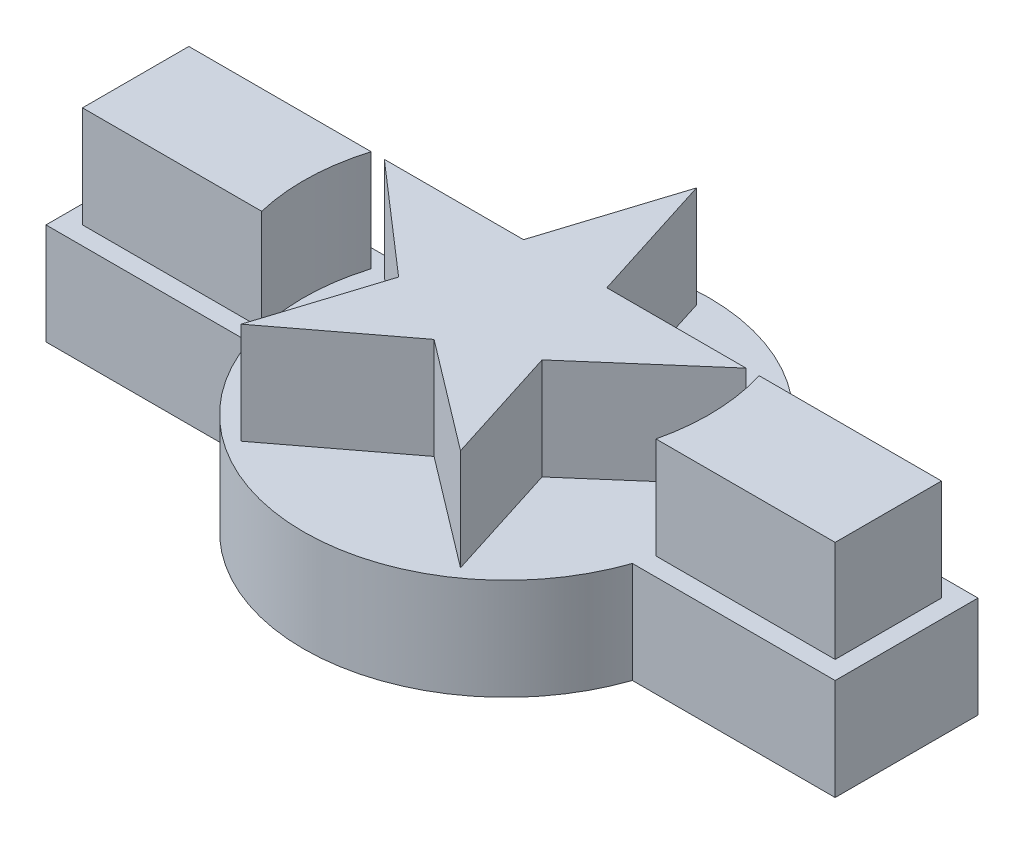
ISO-10303-21;
HEADER;
FILE_DESCRIPTION(('STEP AP214'),'2;1');
FILE_NAME('part.step','',(''),(''),'','','');
FILE_SCHEMA(('AUTOMOTIVE_DESIGN { 1 0 10303 214 1 1 1 1 }'));
ENDSEC;
DATA;
#1=APPLICATION_CONTEXT('core data for automotive mechanical design processes');
#2=APPLICATION_PROTOCOL_DEFINITION('international standard','automotive_design',2000,#1);
#3=PRODUCT_CONTEXT('',#1,'mechanical');
#4=PRODUCT('Part','Part','',(#3));
#5=PRODUCT_RELATED_PRODUCT_CATEGORY('part','',(#4));
#6=PRODUCT_DEFINITION_FORMATION('','',#4);
#7=PRODUCT_DEFINITION_CONTEXT('part definition',#1,'design');
#8=PRODUCT_DEFINITION('design','',#6,#7);
#9=PRODUCT_DEFINITION_SHAPE('','',#8);
#10=(LENGTH_UNIT() NAMED_UNIT(*) SI_UNIT(.MILLI.,.METRE.));
#11=(NAMED_UNIT(*) PLANE_ANGLE_UNIT() SI_UNIT($,.RADIAN.));
#12=(NAMED_UNIT(*) SI_UNIT($,.STERADIAN.) SOLID_ANGLE_UNIT());
#13=UNCERTAINTY_MEASURE_WITH_UNIT(LENGTH_MEASURE(1.E-05),#10,'distance_accuracy_value','');
#14=(GEOMETRIC_REPRESENTATION_CONTEXT(3) GLOBAL_UNCERTAINTY_ASSIGNED_CONTEXT((#13)) GLOBAL_UNIT_ASSIGNED_CONTEXT((#10,
#11,#12)) REPRESENTATION_CONTEXT('',''));
#15=CARTESIAN_POINT('',(0.,0.,0.));
#16=DIRECTION('',(0.,0.,1.));
#17=DIRECTION('',(1.,0.,0.));
#18=AXIS2_PLACEMENT_3D('',#15,#16,#17);
#19=CARTESIAN_POINT('',(-0.85739094536806,5.,1.12957085553152));
#20=DIRECTION('',(-0.604599114862384,0.,0.796529918024189));
#21=DIRECTION('',(0.796529918024189,0.,0.604599114862384));
#22=AXIS2_PLACEMENT_3D('',#19,#20,#21);
#23=PLANE('',#22);
#24=DIRECTION('',(-0.796529918024189,0.,-0.604599114862384));
#25=VECTOR('',#24,1.);
#26=CARTESIAN_POINT('',(-0.85739094536806,2.5,1.12957085553152));
#27=LINE('',#26,#25);
#28=CARTESIAN_POINT('',(2.70346756283628,2.5,3.83240957319178));
#29=VERTEX_POINT('',#28);
#30=CARTESIAN_POINT('',(0.,2.5,1.7803660045027));
#31=VERTEX_POINT('',#30);
#32=EDGE_CURVE('E365',#29,#31,#27,.T.);
#33=ORIENTED_EDGE('',*,*,#32,.F.);
#34=DIRECTION('',(0.,-1.,0.));
#35=VECTOR('',#34,1.);
#36=CARTESIAN_POINT('',(2.70346756283628,5.,3.83240957319178));
#37=LINE('',#36,#35);
#38=CARTESIAN_POINT('',(2.70346756283628,5.,3.83240957319178));
#39=VERTEX_POINT('',#38);
#40=EDGE_CURVE('E11',#39,#29,#37,.T.);
#41=ORIENTED_EDGE('',*,*,#40,.F.);
#42=DIRECTION('',(-0.796529918024189,0.,-0.604599114862384));
#43=VECTOR('',#42,1.);
#44=CARTESIAN_POINT('',(-0.85739094536806,5.,1.12957085553152));
#45=LINE('',#44,#43);
#46=CARTESIAN_POINT('',(0.,5.,1.7803660045027));
#47=VERTEX_POINT('',#46);
#48=EDGE_CURVE('E47',#39,#47,#45,.T.);
#49=ORIENTED_EDGE('',*,*,#48,.T.);
#50=DIRECTION('',(0.,-1.,0.));
#51=VECTOR('',#50,1.);
#52=CARTESIAN_POINT('',(0.,5.,1.7803660045027));
#53=LINE('',#52,#51);
#54=EDGE_CURVE('E297',#47,#31,#53,.T.);
#55=ORIENTED_EDGE('',*,*,#54,.T.);
#56=EDGE_LOOP('',(#33,#41,#49,#55));
#57=FACE_BOUND('',#56,.T.);
#58=ADVANCED_FACE('F33',(#57),#23,.T.);
#59=CARTESIAN_POINT('',(1.35173378141814,5.,-0.428795213404107));
#60=DIRECTION('',(0.953190667792949,0.,-0.302369890750439));
#61=DIRECTION('',(-0.302369890750439,0.,-0.953190667792949));
#62=AXIS2_PLACEMENT_3D('',#59,#60,#61);
#63=PLANE('',#62);
#64=DIRECTION('',(0.302369890750439,0.,0.953190667792949));
#65=VECTOR('',#64,1.);
#66=CARTESIAN_POINT('',(1.35173378141814,2.5,-0.428795213404107));
#67=LINE('',#66,#65);
#68=CARTESIAN_POINT('',(1.76883104180645,2.5,0.886061947728644));
#69=VERTEX_POINT('',#68);
#70=EDGE_CURVE('E363',#69,#29,#67,.T.);
#71=ORIENTED_EDGE('',*,*,#70,.F.);
#72=DIRECTION('',(0.,-1.,0.));
#73=VECTOR('',#72,1.);
#74=CARTESIAN_POINT('',(1.76883104180645,5.,0.886061947728644));
#75=LINE('',#74,#73);
#76=CARTESIAN_POINT('',(1.76883104180645,5.,0.886061947728644));
#77=VERTEX_POINT('',#76);
#78=EDGE_CURVE('E40',#77,#69,#75,.T.);
#79=ORIENTED_EDGE('',*,*,#78,.F.);
#80=DIRECTION('',(0.302369890750439,0.,0.953190667792949));
#81=VECTOR('',#80,1.);
#82=CARTESIAN_POINT('',(1.35173378141814,5.,-0.428795213404107));
#83=LINE('',#82,#81);
#84=EDGE_CURVE('E387',#77,#39,#83,.T.);
#85=ORIENTED_EDGE('',*,*,#84,.T.);
#86=ORIENTED_EDGE('',*,*,#40,.T.);
#87=EDGE_LOOP('',(#71,#79,#85,#86));
#88=FACE_BOUND('',#87,.T.);
#89=ADVANCED_FACE('F411',(#88),#63,.T.);
#90=CARTESIAN_POINT('',(1.20004809720322,5.,1.38049741816829));
#91=DIRECTION('',(0.656059028990503,0.,0.754709580222776));
#92=DIRECTION('',(0.754709580222776,0.,-0.656059028990503));
#93=AXIS2_PLACEMENT_3D('',#90,#91,#92);
#94=PLANE('',#93);
#95=DIRECTION('',(-0.754709580222776,0.,0.656059028990503));
#96=VECTOR('',#95,1.);
#97=CARTESIAN_POINT('',(1.20004809720322,2.5,1.38049741816829));
#98=LINE('',#97,#96);
#99=CARTESIAN_POINT('',(4.45932863153049,2.5,-1.45275192514496));
#100=VERTEX_POINT('',#99);
#101=EDGE_CURVE('E361',#100,#69,#98,.T.);
#102=ORIENTED_EDGE('',*,*,#101,.F.);
#103=DIRECTION('',(0.,-1.,0.));
#104=VECTOR('',#103,1.);
#105=CARTESIAN_POINT('',(4.45932863153049,5.,-1.45275192514496));
#106=LINE('',#105,#104);
#107=CARTESIAN_POINT('',(4.45932863153049,5.,-1.45275192514496));
#108=VERTEX_POINT('',#107);
#109=EDGE_CURVE('E401',#108,#100,#106,.T.);
#110=ORIENTED_EDGE('',*,*,#109,.F.);
#111=DIRECTION('',(-0.754709580222776,0.,0.656059028990503));
#112=VECTOR('',#111,1.);
#113=CARTESIAN_POINT('',(1.20004809720322,5.,1.38049741816829));
#114=LINE('',#113,#112);
#115=EDGE_CURVE('E390',#108,#77,#114,.T.);
#116=ORIENTED_EDGE('',*,*,#115,.T.);
#117=ORIENTED_EDGE('',*,*,#78,.T.);
#118=EDGE_LOOP('',(#102,#110,#116,#117));
#119=FACE_BOUND('',#118,.T.);
#120=ADVANCED_FACE('F406',(#119),#94,.T.);
#121=CARTESIAN_POINT('',(0.,5.,-1.45275192514496));
#122=DIRECTION('',(0.,0.,-1.));
#123=DIRECTION('',(-1.,0.,0.));
#124=AXIS2_PLACEMENT_3D('',#121,#122,#123);
#125=PLANE('',#124);
#126=DIRECTION('',(1.,0.,0.));
#127=VECTOR('',#126,1.);
#128=CARTESIAN_POINT('',(0.,2.5,-1.45275192514496));
#129=LINE('',#128,#127);
#130=CARTESIAN_POINT('',(1.0269155792224,2.5,-1.45275192514496));
#131=VERTEX_POINT('',#130);
#132=EDGE_CURVE('E359',#131,#100,#129,.T.);
#133=ORIENTED_EDGE('',*,*,#132,.F.);
#134=DIRECTION('',(0.,-1.,0.));
#135=VECTOR('',#134,1.);
#136=CARTESIAN_POINT('',(1.0269155792224,5.,-1.45275192514496));
#137=LINE('',#136,#135);
#138=CARTESIAN_POINT('',(1.0269155792224,5.,-1.45275192514496));
#139=VERTEX_POINT('',#138);
#140=EDGE_CURVE('E398',#139,#131,#137,.T.);
#141=ORIENTED_EDGE('',*,*,#140,.F.);
#142=DIRECTION('',(1.,0.,0.));
#143=VECTOR('',#142,1.);
#144=CARTESIAN_POINT('',(0.,5.,-1.45275192514496));
#145=LINE('',#144,#143);
#146=EDGE_CURVE('E393',#139,#108,#145,.T.);
#147=ORIENTED_EDGE('',*,*,#146,.T.);
#148=ORIENTED_EDGE('',*,*,#109,.T.);
#149=EDGE_LOOP('',(#133,#141,#147,#148));
#150=FACE_BOUND('',#149,.T.);
#151=ADVANCED_FACE('F430',(#150),#125,.T.);
#152=CARTESIAN_POINT('',(1.35173378141814,5.,-0.428795213404107));
#153=DIRECTION('',(0.953190667792949,0.,-0.302369890750439));
#154=DIRECTION('',(-0.302369890750439,0.,-0.953190667792949));
#155=AXIS2_PLACEMENT_3D('',#152,#153,#154);
#156=PLANE('',#155);
#157=DIRECTION('',(0.302369890750439,0.,0.953190667792949));
#158=VECTOR('',#157,1.);
#159=CARTESIAN_POINT('',(1.35173378141814,2.5,-0.428795213404107));
#160=LINE('',#159,#158);
#161=CARTESIAN_POINT('',(0.,2.5,-4.69));
#162=VERTEX_POINT('',#161);
#163=EDGE_CURVE('E357',#162,#131,#160,.T.);
#164=ORIENTED_EDGE('',*,*,#163,.F.);
#165=DIRECTION('',(0.,-1.,0.));
#166=VECTOR('',#165,1.);
#167=CARTESIAN_POINT('',(0.,5.,-4.69));
#168=LINE('',#167,#166);
#169=CARTESIAN_POINT('',(0.,5.,-4.69));
#170=VERTEX_POINT('',#169);
#171=EDGE_CURVE('E55',#170,#162,#168,.T.);
#172=ORIENTED_EDGE('',*,*,#171,.F.);
#173=DIRECTION('',(0.302369890750439,0.,0.953190667792949));
#174=VECTOR('',#173,1.);
#175=CARTESIAN_POINT('',(1.35173378141814,5.,-0.428795213404107));
#176=LINE('',#175,#174);
#177=EDGE_CURVE('E396',#170,#139,#176,.T.);
#178=ORIENTED_EDGE('',*,*,#177,.T.);
#179=ORIENTED_EDGE('',*,*,#140,.T.);
#180=EDGE_LOOP('',(#164,#172,#178,#179));
#181=FACE_BOUND('',#180,.T.);
#182=ADVANCED_FACE('F431',(#181),#156,.T.);
#183=CARTESIAN_POINT('',(0.,5.,0.));
#184=DIRECTION('',(0.,1.,0.));
#185=DIRECTION('',(0.,0.,1.));
#186=AXIS2_PLACEMENT_3D('',#183,#184,#185);
#187=PLANE('',#186);
#188=ORIENTED_EDGE('',*,*,#48,.F.);
#189=ORIENTED_EDGE('',*,*,#84,.F.);
#190=ORIENTED_EDGE('',*,*,#115,.F.);
#191=ORIENTED_EDGE('',*,*,#146,.F.);
#192=ORIENTED_EDGE('',*,*,#177,.F.);
#193=DIRECTION('',(-0.302369890750439,0.,0.953190667792949));
#194=VECTOR('',#193,1.);
#195=CARTESIAN_POINT('',(-1.35173378141814,5.,-0.428795213404107));
#196=LINE('',#195,#194);
#197=CARTESIAN_POINT('',(-1.0269155792224,5.,-1.45275192514496));
#198=VERTEX_POINT('',#197);
#199=EDGE_CURVE('E295',#170,#198,#196,.T.);
#200=ORIENTED_EDGE('',*,*,#199,.T.);
#201=DIRECTION('',(-1.,0.,0.));
#202=VECTOR('',#201,1.);
#203=CARTESIAN_POINT('',(0.,5.,-1.45275192514496));
#204=LINE('',#203,#202);
#205=CARTESIAN_POINT('',(-4.45932863153049,5.,-1.45275192514496));
#206=VERTEX_POINT('',#205);
#207=EDGE_CURVE('E293',#198,#206,#204,.T.);
#208=ORIENTED_EDGE('',*,*,#207,.T.);
#209=DIRECTION('',(0.754709580222776,0.,0.656059028990503));
#210=VECTOR('',#209,1.);
#211=CARTESIAN_POINT('',(-1.20004809720322,5.,1.38049741816829));
#212=LINE('',#211,#210);
#213=CARTESIAN_POINT('',(-1.76883104180645,5.,0.886061947728644));
#214=VERTEX_POINT('',#213);
#215=EDGE_CURVE('E291',#206,#214,#212,.T.);
#216=ORIENTED_EDGE('',*,*,#215,.T.);
#217=DIRECTION('',(-0.302369890750439,0.,0.953190667792949));
#218=VECTOR('',#217,1.);
#219=CARTESIAN_POINT('',(-1.35173378141814,5.,-0.428795213404107));
#220=LINE('',#219,#218);
#221=CARTESIAN_POINT('',(-2.70346756283628,5.,3.83240957319178));
#222=VERTEX_POINT('',#221);
#223=EDGE_CURVE('E289',#214,#222,#220,.T.);
#224=ORIENTED_EDGE('',*,*,#223,.T.);
#225=DIRECTION('',(0.796529918024189,0.,-0.604599114862384));
#226=VECTOR('',#225,1.);
#227=CARTESIAN_POINT('',(0.85739094536806,5.,1.12957085553152));
#228=LINE('',#227,#226);
#229=EDGE_CURVE('E287',#222,#47,#228,.T.);
#230=ORIENTED_EDGE('',*,*,#229,.T.);
#231=EDGE_LOOP('',(#188,#189,#190,#191,#192,#200,#208,#216,#224,#230));
#232=FACE_BOUND('',#231,.T.);
#233=ADVANCED_FACE('F413',(#232),#187,.T.);
#234=CARTESIAN_POINT('',(0.,0.,0.));
#235=DIRECTION('',(0.,1.,0.));
#236=DIRECTION('',(0.,0.,1.));
#237=AXIS2_PLACEMENT_3D('',#234,#235,#236);
#238=PLANE('',#237);
#239=CARTESIAN_POINT('',(0.,0.,0.));
#240=DIRECTION('',(0.,1.,0.));
#241=DIRECTION('',(0.,0.,1.));
#242=AXIS2_PLACEMENT_3D('',#239,#240,#241);
#243=CIRCLE('',#242,5.);
#244=CARTESIAN_POINT('',(-4.73033846702723,0.,1.61984505041762));
#245=VERTEX_POINT('',#244);
#246=CARTESIAN_POINT('',(4.73033846702723,0.,1.61984505041762));
#247=VERTEX_POINT('',#246);
#248=EDGE_CURVE('E335',#245,#247,#243,.T.);
#249=ORIENTED_EDGE('',*,*,#248,.F.);
#250=DIRECTION('',(1.,0.,0.));
#251=VECTOR('',#250,1.);
#252=CARTESIAN_POINT('',(0.,0.,1.61984505041763));
#253=LINE('',#252,#251);
#254=CARTESIAN_POINT('',(-9.73033846702723,0.,1.61984505041763));
#255=VERTEX_POINT('',#254);
#256=EDGE_CURVE('E218',#255,#245,#253,.T.);
#257=ORIENTED_EDGE('',*,*,#256,.F.);
#258=DIRECTION('',(0.,0.,1.));
#259=VECTOR('',#258,1.);
#260=CARTESIAN_POINT('',(-9.73033846702723,0.,0.));
#261=LINE('',#260,#259);
#262=CARTESIAN_POINT('',(-9.73033846702723,0.,-1.90275192514496));
#263=VERTEX_POINT('',#262);
#264=EDGE_CURVE('E273',#263,#255,#261,.T.);
#265=ORIENTED_EDGE('',*,*,#264,.F.);
#266=DIRECTION('',(1.,0.,0.));
#267=VECTOR('',#266,1.);
#268=CARTESIAN_POINT('',(0.,0.,-1.90275192514496));
#269=LINE('',#268,#267);
#270=CARTESIAN_POINT('',(-4.62380093768721,0.,-1.90275192514496));
#271=VERTEX_POINT('',#270);
#272=EDGE_CURVE('E243',#263,#271,#269,.T.);
#273=ORIENTED_EDGE('',*,*,#272,.T.);
#274=CARTESIAN_POINT('',(4.62380093768721,0.,-1.90275192514496));
#275=VERTEX_POINT('',#274);
#276=EDGE_CURVE('E339',#275,#271,#243,.T.);
#277=ORIENTED_EDGE('',*,*,#276,.F.);
#278=DIRECTION('',(-1.,0.,0.));
#279=VECTOR('',#278,1.);
#280=CARTESIAN_POINT('',(0.,0.,-1.90275192514496));
#281=LINE('',#280,#279);
#282=CARTESIAN_POINT('',(9.73033846702723,0.,-1.90275192514496));
#283=VERTEX_POINT('',#282);
#284=EDGE_CURVE('E369',#283,#275,#281,.T.);
#285=ORIENTED_EDGE('',*,*,#284,.F.);
#286=DIRECTION('',(0.,0.,1.));
#287=VECTOR('',#286,1.);
#288=CARTESIAN_POINT('',(9.73033846702723,0.,0.));
#289=LINE('',#288,#287);
#290=CARTESIAN_POINT('',(9.73033846702723,0.,1.61984505041763));
#291=VERTEX_POINT('',#290);
#292=EDGE_CURVE('E373',#283,#291,#289,.T.);
#293=ORIENTED_EDGE('',*,*,#292,.T.);
#294=DIRECTION('',(-1.,0.,0.));
#295=VECTOR('',#294,1.);
#296=CARTESIAN_POINT('',(0.,0.,1.61984505041763));
#297=LINE('',#296,#295);
#298=EDGE_CURVE('E370',#291,#247,#297,.T.);
#299=ORIENTED_EDGE('',*,*,#298,.T.);
#300=EDGE_LOOP('',(#249,#257,#265,#273,#277,#285,#293,#299));
#301=FACE_BOUND('',#300,.T.);
#302=ADVANCED_FACE('F470',(#301),#238,.F.);
#303=CARTESIAN_POINT('',(0.,2.5,0.));
#304=DIRECTION('',(0.,-1.,0.));
#305=DIRECTION('',(0.,0.,-1.));
#306=AXIS2_PLACEMENT_3D('',#303,#304,#305);
#307=CYLINDRICAL_SURFACE('',#306,5.);
#308=ORIENTED_EDGE('',*,*,#248,.T.);
#309=DIRECTION('',(0.,-1.,0.));
#310=VECTOR('',#309,1.);
#311=CARTESIAN_POINT('',(4.73033846702723,2.5,1.61984505041762));
#312=LINE('',#311,#310);
#313=CARTESIAN_POINT('',(4.73033846702723,2.5,1.61984505041762));
#314=VERTEX_POINT('',#313);
#315=EDGE_CURVE('E384',#314,#247,#312,.T.);
#316=ORIENTED_EDGE('',*,*,#315,.F.);
#317=CARTESIAN_POINT('',(0.,2.5,0.));
#318=DIRECTION('',(0.,1.,0.));
#319=DIRECTION('',(0.,0.,1.));
#320=AXIS2_PLACEMENT_3D('',#317,#318,#319);
#321=CIRCLE('',#320,5.);
#322=CARTESIAN_POINT('',(-4.73033846702723,2.5,1.61984505041762));
#323=VERTEX_POINT('',#322);
#324=EDGE_CURVE('E343',#323,#314,#321,.T.);
#325=ORIENTED_EDGE('',*,*,#324,.F.);
#326=DIRECTION('',(0.,-1.,0.));
#327=VECTOR('',#326,1.);
#328=CARTESIAN_POINT('',(-4.73033846702723,2.5,1.61984505041762));
#329=LINE('',#328,#327);
#330=EDGE_CURVE('E284',#323,#245,#329,.T.);
#331=ORIENTED_EDGE('',*,*,#330,.T.);
#332=EDGE_LOOP('',(#308,#316,#325,#331));
#333=FACE_BOUND('',#332,.T.);
#334=ADVANCED_FACE('F473',(#333),#307,.T.);
#335=CARTESIAN_POINT('',(0.,2.5,1.61984505041763));
#336=DIRECTION('',(0.,0.,1.));
#337=DIRECTION('',(1.,0.,0.));
#338=AXIS2_PLACEMENT_3D('',#335,#336,#337);
#339=PLANE('',#338);
#340=ORIENTED_EDGE('',*,*,#298,.F.);
#341=DIRECTION('',(0.,-1.,0.));
#342=VECTOR('',#341,1.);
#343=CARTESIAN_POINT('',(9.73033846702723,2.5,1.61984505041763));
#344=LINE('',#343,#342);
#345=CARTESIAN_POINT('',(9.73033846702723,2.5,1.61984505041763));
#346=VERTEX_POINT('',#345);
#347=EDGE_CURVE('E382',#346,#291,#344,.T.);
#348=ORIENTED_EDGE('',*,*,#347,.F.);
#349=DIRECTION('',(-1.,0.,0.));
#350=VECTOR('',#349,1.);
#351=CARTESIAN_POINT('',(0.,2.5,1.61984505041763));
#352=LINE('',#351,#350);
#353=EDGE_CURVE('E348',#346,#314,#352,.T.);
#354=ORIENTED_EDGE('',*,*,#353,.T.);
#355=ORIENTED_EDGE('',*,*,#315,.T.);
#356=EDGE_LOOP('',(#340,#348,#354,#355));
#357=FACE_BOUND('',#356,.T.);
#358=ADVANCED_FACE('F477',(#357),#339,.T.);
#359=CARTESIAN_POINT('',(9.73033846702723,2.5,0.));
#360=DIRECTION('',(1.,0.,0.));
#361=DIRECTION('',(0.,0.,-1.));
#362=AXIS2_PLACEMENT_3D('',#359,#360,#361);
#363=PLANE('',#362);
#364=ORIENTED_EDGE('',*,*,#292,.F.);
#365=DIRECTION('',(0.,-1.,0.));
#366=VECTOR('',#365,1.);
#367=CARTESIAN_POINT('',(9.73033846702723,2.5,-1.90275192514496));
#368=LINE('',#367,#366);
#369=CARTESIAN_POINT('',(9.73033846702723,2.5,-1.90275192514496));
#370=VERTEX_POINT('',#369);
#371=EDGE_CURVE('E380',#370,#283,#368,.T.);
#372=ORIENTED_EDGE('',*,*,#371,.F.);
#373=DIRECTION('',(0.,0.,1.));
#374=VECTOR('',#373,1.);
#375=CARTESIAN_POINT('',(9.73033846702723,2.5,0.));
#376=LINE('',#375,#374);
#377=EDGE_CURVE('E351',#370,#346,#376,.T.);
#378=ORIENTED_EDGE('',*,*,#377,.T.);
#379=ORIENTED_EDGE('',*,*,#347,.T.);
#380=EDGE_LOOP('',(#364,#372,#378,#379));
#381=FACE_BOUND('',#380,.T.);
#382=ADVANCED_FACE('F480',(#381),#363,.T.);
#383=CARTESIAN_POINT('',(0.,2.5,-1.90275192514496));
#384=DIRECTION('',(0.,0.,1.));
#385=DIRECTION('',(1.,0.,0.));
#386=AXIS2_PLACEMENT_3D('',#383,#384,#385);
#387=PLANE('',#386);
#388=ORIENTED_EDGE('',*,*,#284,.T.);
#389=DIRECTION('',(0.,-1.,0.));
#390=VECTOR('',#389,1.);
#391=CARTESIAN_POINT('',(4.62380093768721,2.5,-1.90275192514496));
#392=LINE('',#391,#390);
#393=CARTESIAN_POINT('',(4.62380093768721,2.5,-1.90275192514496));
#394=VERTEX_POINT('',#393);
#395=EDGE_CURVE('E367',#394,#275,#392,.T.);
#396=ORIENTED_EDGE('',*,*,#395,.F.);
#397=DIRECTION('',(-1.,0.,0.));
#398=VECTOR('',#397,1.);
#399=CARTESIAN_POINT('',(0.,2.5,-1.90275192514496));
#400=LINE('',#399,#398);
#401=EDGE_CURVE('E354',#370,#394,#400,.T.);
#402=ORIENTED_EDGE('',*,*,#401,.F.);
#403=ORIENTED_EDGE('',*,*,#371,.T.);
#404=EDGE_LOOP('',(#388,#396,#402,#403));
#405=FACE_BOUND('',#404,.T.);
#406=ADVANCED_FACE('F484',(#405),#387,.F.);
#407=ORIENTED_EDGE('',*,*,#276,.T.);
#408=DIRECTION('',(0.,-1.,0.));
#409=VECTOR('',#408,1.);
#410=CARTESIAN_POINT('',(-4.62380093768721,2.5,-1.90275192514496));
#411=LINE('',#410,#409);
#412=CARTESIAN_POINT('',(-4.62380093768721,2.5,-1.90275192514496));
#413=VERTEX_POINT('',#412);
#414=EDGE_CURVE('E270',#413,#271,#411,.T.);
#415=ORIENTED_EDGE('',*,*,#414,.F.);
#416=EDGE_CURVE('E342',#394,#413,#321,.T.);
#417=ORIENTED_EDGE('',*,*,#416,.F.);
#418=ORIENTED_EDGE('',*,*,#395,.T.);
#419=EDGE_LOOP('',(#407,#415,#417,#418));
#420=FACE_BOUND('',#419,.T.);
#421=ADVANCED_FACE('F488',(#420),#307,.T.);
#422=CARTESIAN_POINT('',(0.,2.5,0.));
#423=DIRECTION('',(0.,1.,0.));
#424=DIRECTION('',(0.,0.,1.));
#425=AXIS2_PLACEMENT_3D('',#422,#423,#424);
#426=PLANE('',#425);
#427=ORIENTED_EDGE('',*,*,#32,.T.);
#428=DIRECTION('',(0.796529918024189,0.,-0.604599114862384));
#429=VECTOR('',#428,1.);
#430=CARTESIAN_POINT('',(0.85739094536806,2.5,1.12957085553152));
#431=LINE('',#430,#429);
#432=CARTESIAN_POINT('',(-2.70346756283628,2.5,3.83240957319178));
#433=VERTEX_POINT('',#432);
#434=EDGE_CURVE('E267',#433,#31,#431,.T.);
#435=ORIENTED_EDGE('',*,*,#434,.F.);
#436=DIRECTION('',(-0.302369890750439,0.,0.953190667792949));
#437=VECTOR('',#436,1.);
#438=CARTESIAN_POINT('',(-1.35173378141814,2.5,-0.428795213404107));
#439=LINE('',#438,#437);
#440=CARTESIAN_POINT('',(-1.76883104180645,2.5,0.886061947728644));
#441=VERTEX_POINT('',#440);
#442=EDGE_CURVE('E265',#441,#433,#439,.T.);
#443=ORIENTED_EDGE('',*,*,#442,.F.);
#444=DIRECTION('',(0.754709580222776,0.,0.656059028990503));
#445=VECTOR('',#444,1.);
#446=CARTESIAN_POINT('',(-1.20004809720322,2.5,1.38049741816829));
#447=LINE('',#446,#445);
#448=CARTESIAN_POINT('',(-4.45932863153049,2.5,-1.45275192514496));
#449=VERTEX_POINT('',#448);
#450=EDGE_CURVE('E263',#449,#441,#447,.T.);
#451=ORIENTED_EDGE('',*,*,#450,.F.);
#452=DIRECTION('',(-1.,0.,0.));
#453=VECTOR('',#452,1.);
#454=CARTESIAN_POINT('',(0.,2.5,-1.45275192514496));
#455=LINE('',#454,#453);
#456=CARTESIAN_POINT('',(-1.0269155792224,2.5,-1.45275192514496));
#457=VERTEX_POINT('',#456);
#458=EDGE_CURVE('E261',#457,#449,#455,.T.);
#459=ORIENTED_EDGE('',*,*,#458,.F.);
#460=DIRECTION('',(-0.302369890750439,0.,0.953190667792949));
#461=VECTOR('',#460,1.);
#462=CARTESIAN_POINT('',(-1.35173378141814,2.5,-0.428795213404107));
#463=LINE('',#462,#461);
#464=EDGE_CURVE('E259',#162,#457,#463,.T.);
#465=ORIENTED_EDGE('',*,*,#464,.F.);
#466=ORIENTED_EDGE('',*,*,#163,.T.);
#467=ORIENTED_EDGE('',*,*,#132,.T.);
#468=ORIENTED_EDGE('',*,*,#101,.T.);
#469=ORIENTED_EDGE('',*,*,#70,.T.);
#470=EDGE_LOOP('',(#427,#435,#443,#451,#459,#465,#466,#467,#468,#469));
#471=FACE_BOUND('',#470,.T.);
#472=DIRECTION('',(-1.,0.,0.));
#473=VECTOR('',#472,1.);
#474=CARTESIAN_POINT('',(0.,2.5,1.16984505041762));
#475=LINE('',#474,#473);
#476=CARTESIAN_POINT('',(9.28033846702723,2.5,1.16984505041762));
#477=VERTEX_POINT('',#476);
#478=CARTESIAN_POINT('',(4.86122027458265,2.5,1.16984505041762));
#479=VERTEX_POINT('',#478);
#480=EDGE_CURVE('E336',#477,#479,#475,.T.);
#481=ORIENTED_EDGE('',*,*,#480,.T.);
#482=CARTESIAN_POINT('',(4.78429846936702,2.5,-1.45275192514496));
#483=VERTEX_POINT('',#482);
#484=EDGE_CURVE('E338',#479,#483,#321,.T.);
#485=ORIENTED_EDGE('',*,*,#484,.T.);
#486=DIRECTION('',(-1.,0.,0.));
#487=VECTOR('',#486,1.);
#488=CARTESIAN_POINT('',(0.,2.5,-1.45275192514496));
#489=LINE('',#488,#487);
#490=CARTESIAN_POINT('',(9.28033846702723,2.5,-1.45275192514496));
#491=VERTEX_POINT('',#490);
#492=EDGE_CURVE('E341',#491,#483,#489,.T.);
#493=ORIENTED_EDGE('',*,*,#492,.F.);
#494=DIRECTION('',(0.,0.,1.));
#495=VECTOR('',#494,1.);
#496=CARTESIAN_POINT('',(9.28033846702723,2.5,0.));
#497=LINE('',#496,#495);
#498=EDGE_CURVE('E346',#491,#477,#497,.T.);
#499=ORIENTED_EDGE('',*,*,#498,.T.);
#500=EDGE_LOOP('',(#481,#485,#493,#499));
#501=FACE_BOUND('',#500,.T.);
#502=DIRECTION('',(1.,0.,0.));
#503=VECTOR('',#502,1.);
#504=CARTESIAN_POINT('',(0.,2.5,1.61984505041763));
#505=LINE('',#504,#503);
#506=CARTESIAN_POINT('',(-9.73033846702723,2.5,1.61984505041763));
#507=VERTEX_POINT('',#506);
#508=EDGE_CURVE('E251',#507,#323,#505,.T.);
#509=ORIENTED_EDGE('',*,*,#508,.T.);
#510=ORIENTED_EDGE('',*,*,#324,.T.);
#511=ORIENTED_EDGE('',*,*,#353,.F.);
#512=ORIENTED_EDGE('',*,*,#377,.F.);
#513=ORIENTED_EDGE('',*,*,#401,.T.);
#514=ORIENTED_EDGE('',*,*,#416,.T.);
#515=DIRECTION('',(1.,0.,0.));
#516=VECTOR('',#515,1.);
#517=CARTESIAN_POINT('',(0.,2.5,-1.90275192514496));
#518=LINE('',#517,#516);
#519=CARTESIAN_POINT('',(-9.73033846702723,2.5,-1.90275192514496));
#520=VERTEX_POINT('',#519);
#521=EDGE_CURVE('E256',#520,#413,#518,.T.);
#522=ORIENTED_EDGE('',*,*,#521,.F.);
#523=DIRECTION('',(0.,0.,1.));
#524=VECTOR('',#523,1.);
#525=CARTESIAN_POINT('',(-9.73033846702723,2.5,0.));
#526=LINE('',#525,#524);
#527=EDGE_CURVE('E254',#520,#507,#526,.T.);
#528=ORIENTED_EDGE('',*,*,#527,.T.);
#529=EDGE_LOOP('',(#509,#510,#511,#512,#513,#514,#522,#528));
#530=FACE_BOUND('',#529,.T.);
#531=DIRECTION('',(1.,0.,0.));
#532=VECTOR('',#531,1.);
#533=CARTESIAN_POINT('',(0.,2.5,1.16984505041762));
#534=LINE('',#533,#532);
#535=CARTESIAN_POINT('',(-9.28033846702723,2.5,1.16984505041762));
#536=VERTEX_POINT('',#535);
#537=CARTESIAN_POINT('',(-4.86122027458265,2.5,1.16984505041762));
#538=VERTEX_POINT('',#537);
#539=EDGE_CURVE('E213',#536,#538,#534,.T.);
#540=ORIENTED_EDGE('',*,*,#539,.F.);
#541=DIRECTION('',(0.,0.,1.));
#542=VECTOR('',#541,1.);
#543=CARTESIAN_POINT('',(-9.28033846702723,2.5,0.));
#544=LINE('',#543,#542);
#545=CARTESIAN_POINT('',(-9.28033846702723,2.5,-1.45275192514496));
#546=VERTEX_POINT('',#545);
#547=EDGE_CURVE('E248',#546,#536,#544,.T.);
#548=ORIENTED_EDGE('',*,*,#547,.F.);
#549=DIRECTION('',(1.,0.,0.));
#550=VECTOR('',#549,1.);
#551=CARTESIAN_POINT('',(0.,2.5,-1.45275192514496));
#552=LINE('',#551,#550);
#553=CARTESIAN_POINT('',(-4.78429846936702,2.5,-1.45275192514496));
#554=VERTEX_POINT('',#553);
#555=EDGE_CURVE('E245',#546,#554,#552,.T.);
#556=ORIENTED_EDGE('',*,*,#555,.T.);
#557=CARTESIAN_POINT('',(0.,2.5,0.));
#558=DIRECTION('',(0.,-1.,0.));
#559=DIRECTION('',(0.,0.,1.));
#560=AXIS2_PLACEMENT_3D('',#557,#558,#559);
#561=CIRCLE('',#560,5.);
#562=EDGE_CURVE('E242',#538,#554,#561,.T.);
#563=ORIENTED_EDGE('',*,*,#562,.F.);
#564=EDGE_LOOP('',(#540,#548,#556,#563));
#565=FACE_BOUND('',#564,.T.);
#566=ADVANCED_FACE('F424',(#471,#501,#530,#565),#426,.T.);
#567=CARTESIAN_POINT('',(0.,5.,0.));
#568=DIRECTION('',(0.,1.,0.));
#569=DIRECTION('',(0.,0.,1.));
#570=AXIS2_PLACEMENT_3D('',#567,#568,#569);
#571=PLANE('',#570);
#572=CARTESIAN_POINT('',(0.,5.,0.));
#573=DIRECTION('',(0.,1.,0.));
#574=DIRECTION('',(0.,0.,1.));
#575=AXIS2_PLACEMENT_3D('',#572,#573,#574);
#576=CIRCLE('',#575,5.);
#577=CARTESIAN_POINT('',(4.86122027458265,5.,1.16984505041762));
#578=VERTEX_POINT('',#577);
#579=CARTESIAN_POINT('',(4.78429846936702,5.,-1.45275192514496));
#580=VERTEX_POINT('',#579);
#581=EDGE_CURVE('E312',#578,#580,#576,.T.);
#582=ORIENTED_EDGE('',*,*,#581,.F.);
#583=DIRECTION('',(-1.,0.,0.));
#584=VECTOR('',#583,1.);
#585=CARTESIAN_POINT('',(0.,5.,1.16984505041762));
#586=LINE('',#585,#584);
#587=CARTESIAN_POINT('',(9.28033846702723,5.,1.16984505041762));
#588=VERTEX_POINT('',#587);
#589=EDGE_CURVE('E315',#588,#578,#586,.T.);
#590=ORIENTED_EDGE('',*,*,#589,.F.);
#591=DIRECTION('',(0.,0.,1.));
#592=VECTOR('',#591,1.);
#593=CARTESIAN_POINT('',(9.28033846702723,5.,0.));
#594=LINE('',#593,#592);
#595=CARTESIAN_POINT('',(9.28033846702723,5.,-1.45275192514496));
#596=VERTEX_POINT('',#595);
#597=EDGE_CURVE('E318',#596,#588,#594,.T.);
#598=ORIENTED_EDGE('',*,*,#597,.F.);
#599=DIRECTION('',(-1.,0.,0.));
#600=VECTOR('',#599,1.);
#601=CARTESIAN_POINT('',(0.,5.,-1.45275192514496));
#602=LINE('',#601,#600);
#603=EDGE_CURVE('E321',#596,#580,#602,.T.);
#604=ORIENTED_EDGE('',*,*,#603,.T.);
#605=EDGE_LOOP('',(#582,#590,#598,#604));
#606=FACE_BOUND('',#605,.T.);
#607=ADVANCED_FACE('F495',(#606),#571,.T.);
#608=CARTESIAN_POINT('',(0.,5.,-1.45275192514496));
#609=DIRECTION('',(0.,0.,1.));
#610=DIRECTION('',(1.,0.,0.));
#611=AXIS2_PLACEMENT_3D('',#608,#609,#610);
#612=PLANE('',#611);
#613=ORIENTED_EDGE('',*,*,#492,.T.);
#614=DIRECTION('',(0.,-1.,0.));
#615=VECTOR('',#614,1.);
#616=CARTESIAN_POINT('',(4.78429846936702,5.,-1.45275192514496));
#617=LINE('',#616,#615);
#618=EDGE_CURVE('E323',#580,#483,#617,.T.);
#619=ORIENTED_EDGE('',*,*,#618,.F.);
#620=ORIENTED_EDGE('',*,*,#603,.F.);
#621=DIRECTION('',(0.,-1.,0.));
#622=VECTOR('',#621,1.);
#623=CARTESIAN_POINT('',(9.28033846702723,5.,-1.45275192514496));
#624=LINE('',#623,#622);
#625=EDGE_CURVE('E326',#596,#491,#624,.T.);
#626=ORIENTED_EDGE('',*,*,#625,.T.);
#627=EDGE_LOOP('',(#613,#619,#620,#626));
#628=FACE_BOUND('',#627,.T.);
#629=ADVANCED_FACE('F506',(#628),#612,.F.);
#630=CARTESIAN_POINT('',(9.28033846702723,5.,0.));
#631=DIRECTION('',(1.,0.,0.));
#632=DIRECTION('',(0.,0.,-1.));
#633=AXIS2_PLACEMENT_3D('',#630,#631,#632);
#634=PLANE('',#633);
#635=DIRECTION('',(0.,-1.,0.));
#636=VECTOR('',#635,1.);
#637=CARTESIAN_POINT('',(9.28033846702723,5.,1.16984505041762));
#638=LINE('',#637,#636);
#639=EDGE_CURVE('E329',#588,#477,#638,.T.);
#640=ORIENTED_EDGE('',*,*,#639,.T.);
#641=ORIENTED_EDGE('',*,*,#498,.F.);
#642=ORIENTED_EDGE('',*,*,#625,.F.);
#643=ORIENTED_EDGE('',*,*,#597,.T.);
#644=EDGE_LOOP('',(#640,#641,#642,#643));
#645=FACE_BOUND('',#644,.T.);
#646=ADVANCED_FACE('F502',(#645),#634,.T.);
#647=CARTESIAN_POINT('',(0.,5.,1.16984505041762));
#648=DIRECTION('',(0.,0.,1.));
#649=DIRECTION('',(1.,0.,0.));
#650=AXIS2_PLACEMENT_3D('',#647,#648,#649);
#651=PLANE('',#650);
#652=DIRECTION('',(0.,-1.,0.));
#653=VECTOR('',#652,1.);
#654=CARTESIAN_POINT('',(4.86122027458265,5.,1.16984505041762));
#655=LINE('',#654,#653);
#656=EDGE_CURVE('E332',#578,#479,#655,.T.);
#657=ORIENTED_EDGE('',*,*,#656,.T.);
#658=ORIENTED_EDGE('',*,*,#480,.F.);
#659=ORIENTED_EDGE('',*,*,#639,.F.);
#660=ORIENTED_EDGE('',*,*,#589,.T.);
#661=EDGE_LOOP('',(#657,#658,#659,#660));
#662=FACE_BOUND('',#661,.T.);
#663=ADVANCED_FACE('F498',(#662),#651,.T.);
#664=CARTESIAN_POINT('',(0.,5.,0.));
#665=DIRECTION('',(0.,-1.,0.));
#666=DIRECTION('',(0.,0.,-1.));
#667=AXIS2_PLACEMENT_3D('',#664,#665,#666);
#668=CYLINDRICAL_SURFACE('',#667,5.);
#669=ORIENTED_EDGE('',*,*,#618,.T.);
#670=ORIENTED_EDGE('',*,*,#484,.F.);
#671=ORIENTED_EDGE('',*,*,#656,.F.);
#672=ORIENTED_EDGE('',*,*,#581,.T.);
#673=EDGE_LOOP('',(#669,#670,#671,#672));
#674=FACE_BOUND('',#673,.T.);
#675=ADVANCED_FACE('F455',(#674),#668,.F.);
#676=CARTESIAN_POINT('',(0.85739094536806,5.,1.12957085553152));
#677=DIRECTION('',(0.604599114862384,0.,0.796529918024189));
#678=DIRECTION('',(-0.796529918024189,0.,0.604599114862384));
#679=AXIS2_PLACEMENT_3D('',#676,#677,#678);
#680=PLANE('',#679);
#681=ORIENTED_EDGE('',*,*,#434,.T.);
#682=ORIENTED_EDGE('',*,*,#54,.F.);
#683=ORIENTED_EDGE('',*,*,#229,.F.);
#684=DIRECTION('',(0.,-1.,0.));
#685=VECTOR('',#684,1.);
#686=CARTESIAN_POINT('',(-2.70346756283628,5.,3.83240957319178));
#687=LINE('',#686,#685);
#688=EDGE_CURVE('E309',#222,#433,#687,.T.);
#689=ORIENTED_EDGE('',*,*,#688,.T.);
#690=EDGE_LOOP('',(#681,#682,#683,#689));
#691=FACE_BOUND('',#690,.T.);
#692=ADVANCED_FACE('F420',(#691),#680,.T.);
#693=CARTESIAN_POINT('',(-1.35173378141814,5.,-0.428795213404107));
#694=DIRECTION('',(-0.953190667792949,0.,-0.302369890750439));
#695=DIRECTION('',(0.302369890750439,0.,-0.953190667792949));
#696=AXIS2_PLACEMENT_3D('',#693,#694,#695);
#697=PLANE('',#696);
#698=ORIENTED_EDGE('',*,*,#442,.T.);
#699=ORIENTED_EDGE('',*,*,#688,.F.);
#700=ORIENTED_EDGE('',*,*,#223,.F.);
#701=DIRECTION('',(0.,-1.,0.));
#702=VECTOR('',#701,1.);
#703=CARTESIAN_POINT('',(-1.76883104180645,5.,0.886061947728644));
#704=LINE('',#703,#702);
#705=EDGE_CURVE('E306',#214,#441,#704,.T.);
#706=ORIENTED_EDGE('',*,*,#705,.T.);
#707=EDGE_LOOP('',(#698,#699,#700,#706));
#708=FACE_BOUND('',#707,.T.);
#709=ADVANCED_FACE('F447',(#708),#697,.T.);
#710=CARTESIAN_POINT('',(-1.20004809720322,5.,1.38049741816829));
#711=DIRECTION('',(-0.656059028990503,0.,0.754709580222776));
#712=DIRECTION('',(-0.754709580222776,0.,-0.656059028990503));
#713=AXIS2_PLACEMENT_3D('',#710,#711,#712);
#714=PLANE('',#713);
#715=ORIENTED_EDGE('',*,*,#450,.T.);
#716=ORIENTED_EDGE('',*,*,#705,.F.);
#717=ORIENTED_EDGE('',*,*,#215,.F.);
#718=DIRECTION('',(0.,-1.,0.));
#719=VECTOR('',#718,1.);
#720=CARTESIAN_POINT('',(-4.45932863153049,5.,-1.45275192514496));
#721=LINE('',#720,#719);
#722=EDGE_CURVE('E303',#206,#449,#721,.T.);
#723=ORIENTED_EDGE('',*,*,#722,.T.);
#724=EDGE_LOOP('',(#715,#716,#717,#723));
#725=FACE_BOUND('',#724,.T.);
#726=ADVANCED_FACE('F444',(#725),#714,.T.);
#727=CARTESIAN_POINT('',(0.,5.,-1.45275192514496));
#728=DIRECTION('',(0.,0.,-1.));
#729=DIRECTION('',(1.,0.,0.));
#730=AXIS2_PLACEMENT_3D('',#727,#728,#729);
#731=PLANE('',#730);
#732=ORIENTED_EDGE('',*,*,#458,.T.);
#733=ORIENTED_EDGE('',*,*,#722,.F.);
#734=ORIENTED_EDGE('',*,*,#207,.F.);
#735=DIRECTION('',(0.,-1.,0.));
#736=VECTOR('',#735,1.);
#737=CARTESIAN_POINT('',(-1.0269155792224,5.,-1.45275192514496));
#738=LINE('',#737,#736);
#739=EDGE_CURVE('E300',#198,#457,#738,.T.);
#740=ORIENTED_EDGE('',*,*,#739,.T.);
#741=EDGE_LOOP('',(#732,#733,#734,#740));
#742=FACE_BOUND('',#741,.T.);
#743=ADVANCED_FACE('F440',(#742),#731,.T.);
#744=CARTESIAN_POINT('',(-1.35173378141814,5.,-0.428795213404107));
#745=DIRECTION('',(-0.953190667792949,0.,-0.302369890750439));
#746=DIRECTION('',(0.302369890750439,0.,-0.953190667792949));
#747=AXIS2_PLACEMENT_3D('',#744,#745,#746);
#748=PLANE('',#747);
#749=ORIENTED_EDGE('',*,*,#464,.T.);
#750=ORIENTED_EDGE('',*,*,#739,.F.);
#751=ORIENTED_EDGE('',*,*,#199,.F.);
#752=ORIENTED_EDGE('',*,*,#171,.T.);
#753=EDGE_LOOP('',(#749,#750,#751,#752));
#754=FACE_BOUND('',#753,.T.);
#755=ADVANCED_FACE('F435',(#754),#748,.T.);
#756=CARTESIAN_POINT('',(0.,2.5,1.61984505041763));
#757=DIRECTION('',(0.,0.,1.));
#758=DIRECTION('',(-1.,0.,0.));
#759=AXIS2_PLACEMENT_3D('',#756,#757,#758);
#760=PLANE('',#759);
#761=ORIENTED_EDGE('',*,*,#256,.T.);
#762=ORIENTED_EDGE('',*,*,#330,.F.);
#763=ORIENTED_EDGE('',*,*,#508,.F.);
#764=DIRECTION('',(0.,-1.,0.));
#765=VECTOR('',#764,1.);
#766=CARTESIAN_POINT('',(-9.73033846702723,2.5,1.61984505041763));
#767=LINE('',#766,#765);
#768=EDGE_CURVE('E282',#507,#255,#767,.T.);
#769=ORIENTED_EDGE('',*,*,#768,.T.);
#770=EDGE_LOOP('',(#761,#762,#763,#769));
#771=FACE_BOUND('',#770,.T.);
#772=ADVANCED_FACE('F552',(#771),#760,.T.);
#773=CARTESIAN_POINT('',(-9.73033846702723,2.5,0.));
#774=DIRECTION('',(-1.,0.,0.));
#775=DIRECTION('',(0.,0.,-1.));
#776=AXIS2_PLACEMENT_3D('',#773,#774,#775);
#777=PLANE('',#776);
#778=ORIENTED_EDGE('',*,*,#264,.T.);
#779=ORIENTED_EDGE('',*,*,#768,.F.);
#780=ORIENTED_EDGE('',*,*,#527,.F.);
#781=DIRECTION('',(0.,-1.,0.));
#782=VECTOR('',#781,1.);
#783=CARTESIAN_POINT('',(-9.73033846702723,2.5,-1.90275192514496));
#784=LINE('',#783,#782);
#785=EDGE_CURVE('E280',#520,#263,#784,.T.);
#786=ORIENTED_EDGE('',*,*,#785,.T.);
#787=EDGE_LOOP('',(#778,#779,#780,#786));
#788=FACE_BOUND('',#787,.T.);
#789=ADVANCED_FACE('F548',(#788),#777,.T.);
#790=CARTESIAN_POINT('',(0.,2.5,-1.90275192514496));
#791=DIRECTION('',(0.,0.,1.));
#792=DIRECTION('',(-1.,0.,0.));
#793=AXIS2_PLACEMENT_3D('',#790,#791,#792);
#794=PLANE('',#793);
#795=ORIENTED_EDGE('',*,*,#272,.F.);
#796=ORIENTED_EDGE('',*,*,#785,.F.);
#797=ORIENTED_EDGE('',*,*,#521,.T.);
#798=ORIENTED_EDGE('',*,*,#414,.T.);
#799=EDGE_LOOP('',(#795,#796,#797,#798));
#800=FACE_BOUND('',#799,.T.);
#801=ADVANCED_FACE('F545',(#800),#794,.F.);
#802=CARTESIAN_POINT('',(0.,5.,0.));
#803=DIRECTION('',(0.,1.,0.));
#804=DIRECTION('',(0.,0.,1.));
#805=AXIS2_PLACEMENT_3D('',#802,#803,#804);
#806=PLANE('',#805);
#807=CARTESIAN_POINT('',(0.,5.,0.));
#808=DIRECTION('',(0.,-1.,0.));
#809=DIRECTION('',(0.,0.,1.));
#810=AXIS2_PLACEMENT_3D('',#807,#808,#809);
#811=CIRCLE('',#810,5.);
#812=CARTESIAN_POINT('',(-4.86122027458265,5.,1.16984505041762));
#813=VERTEX_POINT('',#812);
#814=CARTESIAN_POINT('',(-4.78429846936702,5.,-1.45275192514496));
#815=VERTEX_POINT('',#814);
#816=EDGE_CURVE('E225',#813,#815,#811,.T.);
#817=ORIENTED_EDGE('',*,*,#816,.T.);
#818=DIRECTION('',(1.,0.,0.));
#819=VECTOR('',#818,1.);
#820=CARTESIAN_POINT('',(0.,5.,-1.45275192514496));
#821=LINE('',#820,#819);
#822=CARTESIAN_POINT('',(-9.28033846702723,5.,-1.45275192514496));
#823=VERTEX_POINT('',#822);
#824=EDGE_CURVE('E235',#823,#815,#821,.T.);
#825=ORIENTED_EDGE('',*,*,#824,.F.);
#826=DIRECTION('',(0.,0.,1.));
#827=VECTOR('',#826,1.);
#828=CARTESIAN_POINT('',(-9.28033846702723,5.,0.));
#829=LINE('',#828,#827);
#830=CARTESIAN_POINT('',(-9.28033846702723,5.,1.16984505041762));
#831=VERTEX_POINT('',#830);
#832=EDGE_CURVE('E227',#823,#831,#829,.T.);
#833=ORIENTED_EDGE('',*,*,#832,.T.);
#834=DIRECTION('',(1.,0.,0.));
#835=VECTOR('',#834,1.);
#836=CARTESIAN_POINT('',(0.,5.,1.16984505041762));
#837=LINE('',#836,#835);
#838=EDGE_CURVE('E210',#831,#813,#837,.T.);
#839=ORIENTED_EDGE('',*,*,#838,.T.);
#840=EDGE_LOOP('',(#817,#825,#833,#839));
#841=FACE_BOUND('',#840,.T.);
#842=ADVANCED_FACE('F223',(#841),#806,.T.);
#843=CARTESIAN_POINT('',(0.,5.,-1.45275192514496));
#844=DIRECTION('',(0.,0.,1.));
#845=DIRECTION('',(-1.,0.,0.));
#846=AXIS2_PLACEMENT_3D('',#843,#844,#845);
#847=PLANE('',#846);
#848=ORIENTED_EDGE('',*,*,#555,.F.);
#849=DIRECTION('',(0.,-1.,0.));
#850=VECTOR('',#849,1.);
#851=CARTESIAN_POINT('',(-9.28033846702723,5.,-1.45275192514496));
#852=LINE('',#851,#850);
#853=EDGE_CURVE('E238',#823,#546,#852,.T.);
#854=ORIENTED_EDGE('',*,*,#853,.F.);
#855=ORIENTED_EDGE('',*,*,#824,.T.);
#856=DIRECTION('',(0.,-1.,0.));
#857=VECTOR('',#856,1.);
#858=CARTESIAN_POINT('',(-4.78429846936702,5.,-1.45275192514496));
#859=LINE('',#858,#857);
#860=EDGE_CURVE('E230',#815,#554,#859,.T.);
#861=ORIENTED_EDGE('',*,*,#860,.T.);
#862=EDGE_LOOP('',(#848,#854,#855,#861));
#863=FACE_BOUND('',#862,.T.);
#864=ADVANCED_FACE('F530',(#863),#847,.F.);
#865=CARTESIAN_POINT('',(-9.28033846702723,5.,0.));
#866=DIRECTION('',(-1.,0.,0.));
#867=DIRECTION('',(0.,0.,-1.));
#868=AXIS2_PLACEMENT_3D('',#865,#866,#867);
#869=PLANE('',#868);
#870=DIRECTION('',(0.,-1.,0.));
#871=VECTOR('',#870,1.);
#872=CARTESIAN_POINT('',(-9.28033846702723,5.,1.16984505041762));
#873=LINE('',#872,#871);
#874=EDGE_CURVE('E219',#831,#536,#873,.T.);
#875=ORIENTED_EDGE('',*,*,#874,.F.);
#876=ORIENTED_EDGE('',*,*,#832,.F.);
#877=ORIENTED_EDGE('',*,*,#853,.T.);
#878=ORIENTED_EDGE('',*,*,#547,.T.);
#879=EDGE_LOOP('',(#875,#876,#877,#878));
#880=FACE_BOUND('',#879,.T.);
#881=ADVANCED_FACE('F532',(#880),#869,.T.);
#882=CARTESIAN_POINT('',(0.,5.,1.16984505041762));
#883=DIRECTION('',(0.,0.,1.));
#884=DIRECTION('',(-1.,0.,0.));
#885=AXIS2_PLACEMENT_3D('',#882,#883,#884);
#886=PLANE('',#885);
#887=DIRECTION('',(0.,-1.,0.));
#888=VECTOR('',#887,1.);
#889=CARTESIAN_POINT('',(-4.86122027458265,5.,1.16984505041762));
#890=LINE('',#889,#888);
#891=EDGE_CURVE('E207',#813,#538,#890,.T.);
#892=ORIENTED_EDGE('',*,*,#891,.F.);
#893=ORIENTED_EDGE('',*,*,#838,.F.);
#894=ORIENTED_EDGE('',*,*,#874,.T.);
#895=ORIENTED_EDGE('',*,*,#539,.T.);
#896=EDGE_LOOP('',(#892,#893,#894,#895));
#897=FACE_BOUND('',#896,.T.);
#898=ADVANCED_FACE('F209',(#897),#886,.T.);
#899=CARTESIAN_POINT('',(0.,5.,0.));
#900=DIRECTION('',(0.,-1.,0.));
#901=DIRECTION('',(0.,0.,-1.));
#902=AXIS2_PLACEMENT_3D('',#899,#900,#901);
#903=CYLINDRICAL_SURFACE('',#902,5.);
#904=ORIENTED_EDGE('',*,*,#860,.F.);
#905=ORIENTED_EDGE('',*,*,#816,.F.);
#906=ORIENTED_EDGE('',*,*,#891,.T.);
#907=ORIENTED_EDGE('',*,*,#562,.T.);
#908=EDGE_LOOP('',(#904,#905,#906,#907));
#909=FACE_BOUND('',#908,.T.);
#910=ADVANCED_FACE('F229',(#909),#903,.F.);
#911=CLOSED_SHELL('',(#58,#89,#120,#151,#182,#233,#302,#334,#358,#382,#406,#421,#566,#607,#629,
#646,#663,#675,#692,#709,#726,#743,#755,#772,#789,#801,#842,#864,#881,#898,#910));
#912=MANIFOLD_SOLID_BREP('B2',#911);
#913=ADVANCED_BREP_SHAPE_REPRESENTATION('',(#18,#912),#14);
#914=SHAPE_DEFINITION_REPRESENTATION(#9,#913);
ENDSEC;
END-ISO-10303-21;
